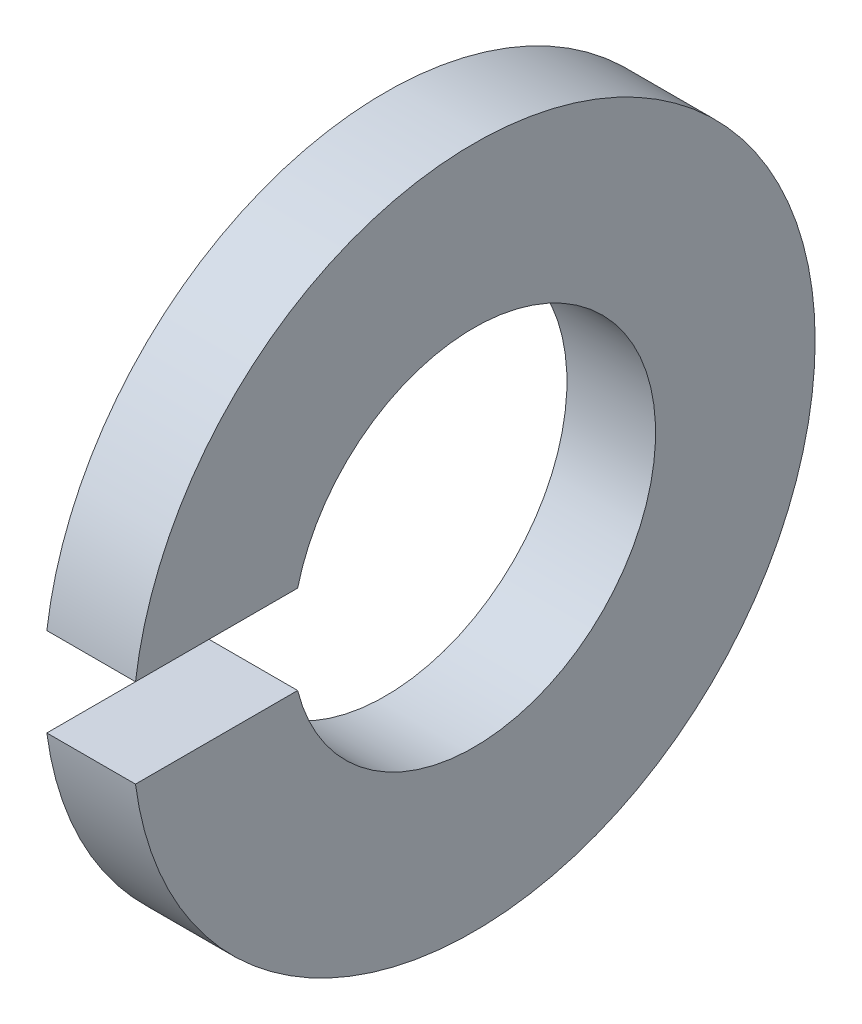
ISO-10303-21;
HEADER;
FILE_DESCRIPTION(('STEP AP214'),'2;1');
FILE_NAME('part.step','',(''),(''),'','','');
FILE_SCHEMA(('AUTOMOTIVE_DESIGN { 1 0 10303 214 1 1 1 1 }'));
ENDSEC;
DATA;
#1=APPLICATION_CONTEXT('core data for automotive mechanical design processes');
#2=APPLICATION_PROTOCOL_DEFINITION('international standard','automotive_design',2000,#1);
#3=PRODUCT_CONTEXT('',#1,'mechanical');
#4=PRODUCT('Part','Part','',(#3));
#5=PRODUCT_RELATED_PRODUCT_CATEGORY('part','',(#4));
#6=PRODUCT_DEFINITION_FORMATION('','',#4);
#7=PRODUCT_DEFINITION_CONTEXT('part definition',#1,'design');
#8=PRODUCT_DEFINITION('design','',#6,#7);
#9=PRODUCT_DEFINITION_SHAPE('','',#8);
#10=(LENGTH_UNIT() NAMED_UNIT(*) SI_UNIT(.MILLI.,.METRE.));
#11=(NAMED_UNIT(*) PLANE_ANGLE_UNIT() SI_UNIT($,.RADIAN.));
#12=(NAMED_UNIT(*) SI_UNIT($,.STERADIAN.) SOLID_ANGLE_UNIT());
#13=UNCERTAINTY_MEASURE_WITH_UNIT(LENGTH_MEASURE(1.E-05),#10,'distance_accuracy_value','');
#14=(GEOMETRIC_REPRESENTATION_CONTEXT(3) GLOBAL_UNCERTAINTY_ASSIGNED_CONTEXT((#13)) GLOBAL_UNIT_ASSIGNED_CONTEXT((#10,
#11,#12)) REPRESENTATION_CONTEXT('',''));
#15=CARTESIAN_POINT('',(0.,0.,0.));
#16=DIRECTION('',(0.,0.,1.));
#17=DIRECTION('',(1.,0.,0.));
#18=AXIS2_PLACEMENT_3D('',#15,#16,#17);
#19=CARTESIAN_POINT('',(-2.,-7.86544015495067,7.63478879865056));
#20=DIRECTION('',(-1.,0.,0.));
#21=DIRECTION('',(0.,1.,0.));
#22=AXIS2_PLACEMENT_3D('',#19,#20,#21);
#23=PLANE('',#22);
#24=CARTESIAN_POINT('',(-2.,0.,0.));
#25=DIRECTION('',(-1.,0.,0.));
#26=DIRECTION('',(0.,2.45135473980622E-08,-1.));
#27=AXIS2_PLACEMENT_3D('',#24,#25,#26);
#28=CIRCLE('',#27,7.7);
#29=CARTESIAN_POINT('',(-2.,-0.999999999999995,7.63478879865056));
#30=VERTEX_POINT('',#29);
#31=CARTESIAN_POINT('',(-2.,0.999999999999997,7.63478879865056));
#32=VERTEX_POINT('',#31);
#33=EDGE_CURVE('E63',#30,#32,#28,.F.);
#34=ORIENTED_EDGE('',*,*,#33,.F.);
#35=DIRECTION('',(0.,0.,-1.));
#36=VECTOR('',#35,1.);
#37=CARTESIAN_POINT('',(-2.,-1.,7.63478879865056));
#38=LINE('',#37,#36);
#39=CARTESIAN_POINT('',(-2.,-1.,3.97617907041421));
#40=VERTEX_POINT('',#39);
#41=EDGE_CURVE('E54',#40,#30,#38,.F.);
#42=ORIENTED_EDGE('',*,*,#41,.F.);
#43=CARTESIAN_POINT('',(-2.,0.,0.));
#44=DIRECTION('',(1.,0.,0.));
#45=DIRECTION('',(0.,0.,-1.));
#46=AXIS2_PLACEMENT_3D('',#43,#44,#45);
#47=CIRCLE('',#46,4.1);
#48=CARTESIAN_POINT('',(-2.,0.999999999999999,3.97617907041421));
#49=VERTEX_POINT('',#48);
#50=EDGE_CURVE('E62',#49,#40,#47,.F.);
#51=ORIENTED_EDGE('',*,*,#50,.F.);
#52=DIRECTION('',(0.,0.,1.));
#53=VECTOR('',#52,1.);
#54=CARTESIAN_POINT('',(-2.,0.999999999999997,3.97617907041421));
#55=LINE('',#54,#53);
#56=EDGE_CURVE('E75',#32,#49,#55,.F.);
#57=ORIENTED_EDGE('',*,*,#56,.F.);
#58=EDGE_LOOP('',(#34,#42,#51,#57));
#59=FACE_BOUND('',#58,.T.);
#60=ADVANCED_FACE('F16',(#59),#23,.T.);
#61=CARTESIAN_POINT('',(0.,0.,0.));
#62=DIRECTION('',(1.,0.,0.));
#63=DIRECTION('',(0.,0.,-1.));
#64=AXIS2_PLACEMENT_3D('',#61,#62,#63);
#65=CYLINDRICAL_SURFACE('',#64,7.7);
#66=DIRECTION('',(1.,0.,0.));
#67=VECTOR('',#66,1.);
#68=CARTESIAN_POINT('',(-2.,0.999999999999998,7.63478879865056));
#69=LINE('',#68,#67);
#70=CARTESIAN_POINT('',(0.,0.999999999999998,7.63478879865056));
#71=VERTEX_POINT('',#70);
#72=EDGE_CURVE('E86',#71,#32,#69,.F.);
#73=ORIENTED_EDGE('',*,*,#72,.F.);
#74=CARTESIAN_POINT('',(0.,0.,0.));
#75=DIRECTION('',(-1.,0.,0.));
#76=DIRECTION('',(0.,0.12987012987013,0.991531012811761));
#77=AXIS2_PLACEMENT_3D('',#74,#75,#76);
#78=CIRCLE('',#77,7.7);
#79=CARTESIAN_POINT('',(0.,-0.999999999999991,7.63478879865056));
#80=VERTEX_POINT('',#79);
#81=EDGE_CURVE('E71',#80,#71,#78,.F.);
#82=ORIENTED_EDGE('',*,*,#81,.F.);
#83=DIRECTION('',(-1.,0.,0.));
#84=VECTOR('',#83,1.);
#85=CARTESIAN_POINT('',(0.,-0.999999999999998,7.63478879865056));
#86=LINE('',#85,#84);
#87=EDGE_CURVE('E57',#30,#80,#86,.F.);
#88=ORIENTED_EDGE('',*,*,#87,.F.);
#89=ORIENTED_EDGE('',*,*,#33,.T.);
#90=EDGE_LOOP('',(#73,#82,#88,#89));
#91=FACE_BOUND('',#90,.T.);
#92=ADVANCED_FACE('F69',(#91),#65,.T.);
#93=CARTESIAN_POINT('',(0.,-7.69999984713157,-7.70078906231173));
#94=DIRECTION('',(1.,0.,0.));
#95=DIRECTION('',(0.,1.,0.));
#96=AXIS2_PLACEMENT_3D('',#93,#94,#95);
#97=PLANE('',#96);
#98=CARTESIAN_POINT('',(0.,0.,0.));
#99=DIRECTION('',(-1.,0.,0.));
#100=DIRECTION('',(0.,0.,-1.));
#101=AXIS2_PLACEMENT_3D('',#98,#99,#100);
#102=CIRCLE('',#101,4.1);
#103=CARTESIAN_POINT('',(0.,-1.,3.97617907041421));
#104=VERTEX_POINT('',#103);
#105=CARTESIAN_POINT('',(0.,1.,3.97617907041421));
#106=VERTEX_POINT('',#105);
#107=EDGE_CURVE('E72',#104,#106,#102,.F.);
#108=ORIENTED_EDGE('',*,*,#107,.F.);
#109=DIRECTION('',(0.,0.,1.));
#110=VECTOR('',#109,1.);
#111=CARTESIAN_POINT('',(0.,-0.999999999999998,3.97617907041421));
#112=LINE('',#111,#110);
#113=EDGE_CURVE('E39',#80,#104,#112,.F.);
#114=ORIENTED_EDGE('',*,*,#113,.F.);
#115=ORIENTED_EDGE('',*,*,#81,.T.);
#116=DIRECTION('',(0.,0.,-1.));
#117=VECTOR('',#116,1.);
#118=CARTESIAN_POINT('',(0.,1.,7.63478879865056));
#119=LINE('',#118,#117);
#120=EDGE_CURVE('E102',#106,#71,#119,.F.);
#121=ORIENTED_EDGE('',*,*,#120,.F.);
#122=EDGE_LOOP('',(#108,#114,#115,#121));
#123=FACE_BOUND('',#122,.T.);
#124=ADVANCED_FACE('F114',(#123),#97,.T.);
#125=CARTESIAN_POINT('',(4.,0.,0.));
#126=DIRECTION('',(-1.,0.,0.));
#127=DIRECTION('',(0.,0.24390243902439,0.969799773271758));
#128=AXIS2_PLACEMENT_3D('',#125,#126,#127);
#129=CYLINDRICAL_SURFACE('',#128,4.1);
#130=DIRECTION('',(-1.,0.,0.));
#131=VECTOR('',#130,1.);
#132=CARTESIAN_POINT('',(0.,1.,3.97617907041421));
#133=LINE('',#132,#131);
#134=EDGE_CURVE('E25',#106,#49,#133,.T.);
#135=ORIENTED_EDGE('',*,*,#134,.T.);
#136=ORIENTED_EDGE('',*,*,#50,.T.);
#137=DIRECTION('',(1.,0.,0.));
#138=VECTOR('',#137,1.);
#139=CARTESIAN_POINT('',(-2.,-1.,3.97617907041421));
#140=LINE('',#139,#138);
#141=EDGE_CURVE('E11',#40,#104,#140,.T.);
#142=ORIENTED_EDGE('',*,*,#141,.T.);
#143=ORIENTED_EDGE('',*,*,#107,.T.);
#144=EDGE_LOOP('',(#135,#136,#142,#143));
#145=FACE_BOUND('',#144,.T.);
#146=ADVANCED_FACE('F111',(#145),#129,.F.);
#147=CARTESIAN_POINT('',(-2.,-1.,3.97617907041421));
#148=DIRECTION('',(0.,1.,0.));
#149=DIRECTION('',(0.,0.,1.));
#150=AXIS2_PLACEMENT_3D('',#147,#148,#149);
#151=PLANE('',#150);
#152=ORIENTED_EDGE('',*,*,#41,.T.);
#153=ORIENTED_EDGE('',*,*,#87,.T.);
#154=ORIENTED_EDGE('',*,*,#113,.T.);
#155=ORIENTED_EDGE('',*,*,#141,.F.);
#156=EDGE_LOOP('',(#152,#153,#154,#155));
#157=FACE_BOUND('',#156,.T.);
#158=ADVANCED_FACE('F56',(#157),#151,.T.);
#159=CARTESIAN_POINT('',(-2.,1.,7.63478879865056));
#160=DIRECTION('',(0.,-1.,0.));
#161=DIRECTION('',(0.,0.,-1.));
#162=AXIS2_PLACEMENT_3D('',#159,#160,#161);
#163=PLANE('',#162);
#164=ORIENTED_EDGE('',*,*,#56,.T.);
#165=ORIENTED_EDGE('',*,*,#134,.F.);
#166=ORIENTED_EDGE('',*,*,#120,.T.);
#167=ORIENTED_EDGE('',*,*,#72,.T.);
#168=EDGE_LOOP('',(#164,#165,#166,#167));
#169=FACE_BOUND('',#168,.T.);
#170=ADVANCED_FACE('F18',(#169),#163,.T.);
#171=CLOSED_SHELL('',(#60,#92,#124,#146,#158,#170));
#172=MANIFOLD_SOLID_BREP('B1',#171);
#173=ADVANCED_BREP_SHAPE_REPRESENTATION('',(#18,#172),#14);
#174=SHAPE_DEFINITION_REPRESENTATION(#9,#173);
ENDSEC;
END-ISO-10303-21;
